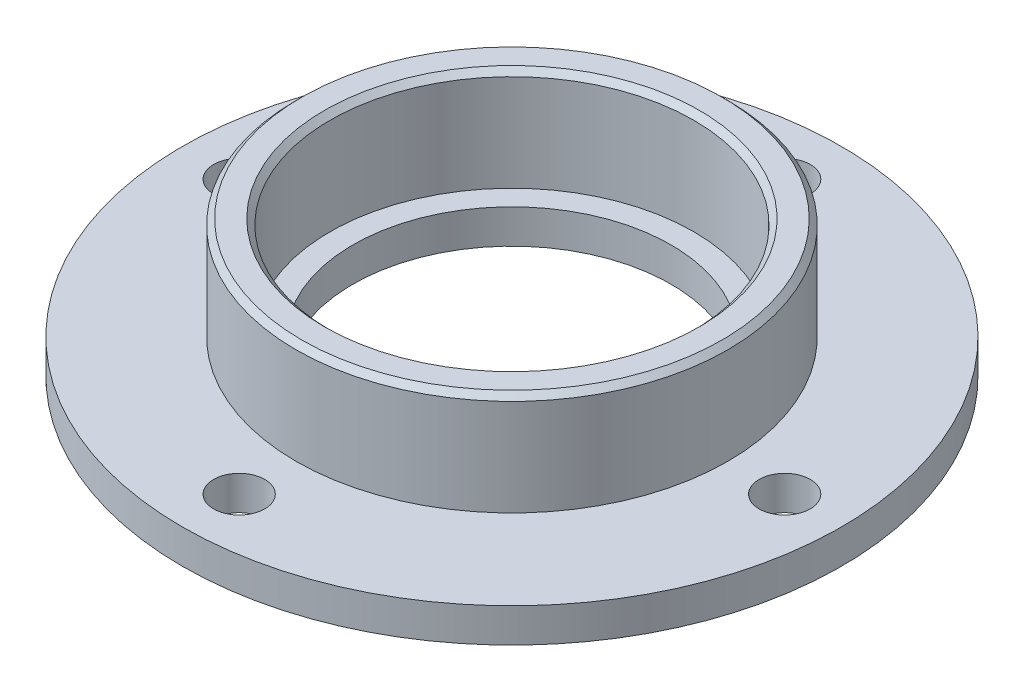
ISO-10303-21;
HEADER;
FILE_DESCRIPTION(('STEP AP214'),'2;1');
FILE_NAME('part.step','',(''),(''),'','','');
FILE_SCHEMA(('AUTOMOTIVE_DESIGN { 1 0 10303 214 1 1 1 1 }'));
ENDSEC;
DATA;
#1=APPLICATION_CONTEXT('core data for automotive mechanical design processes');
#2=APPLICATION_PROTOCOL_DEFINITION('international standard','automotive_design',2000,#1);
#3=PRODUCT_CONTEXT('',#1,'mechanical');
#4=PRODUCT('Part','Part','',(#3));
#5=PRODUCT_RELATED_PRODUCT_CATEGORY('part','',(#4));
#6=PRODUCT_DEFINITION_FORMATION('','',#4);
#7=PRODUCT_DEFINITION_CONTEXT('part definition',#1,'design');
#8=PRODUCT_DEFINITION('design','',#6,#7);
#9=PRODUCT_DEFINITION_SHAPE('','',#8);
#10=(LENGTH_UNIT() NAMED_UNIT(*) SI_UNIT(.MILLI.,.METRE.));
#11=(NAMED_UNIT(*) PLANE_ANGLE_UNIT() SI_UNIT($,.RADIAN.));
#12=(NAMED_UNIT(*) SI_UNIT($,.STERADIAN.) SOLID_ANGLE_UNIT());
#13=UNCERTAINTY_MEASURE_WITH_UNIT(LENGTH_MEASURE(1.E-05),#10,'distance_accuracy_value','');
#14=(GEOMETRIC_REPRESENTATION_CONTEXT(3) GLOBAL_UNCERTAINTY_ASSIGNED_CONTEXT((#13)) GLOBAL_UNIT_ASSIGNED_CONTEXT((#10,
#11,#12)) REPRESENTATION_CONTEXT('',''));
#15=CARTESIAN_POINT('',(0.,0.,0.));
#16=DIRECTION('',(0.,0.,1.));
#17=DIRECTION('',(1.,0.,0.));
#18=AXIS2_PLACEMENT_3D('',#15,#16,#17);
#19=CARTESIAN_POINT('',(0.,3.,0.));
#20=DIRECTION('',(0.,1.,0.));
#21=DIRECTION('',(0.,0.,1.));
#22=AXIS2_PLACEMENT_3D('',#19,#20,#21);
#23=PLANE('',#22);
#24=CARTESIAN_POINT('',(0.,3.,0.));
#25=DIRECTION('',(0.,1.,0.));
#26=DIRECTION('',(0.,0.,1.));
#27=AXIS2_PLACEMENT_3D('',#24,#25,#26);
#28=CIRCLE('',#27,14.);
#29=CARTESIAN_POINT('',(0.,3.,14.));
#30=VERTEX_POINT('',#29);
#31=EDGE_CURVE('E80',#30,#30,#28,.T.);
#32=ORIENTED_EDGE('',*,*,#31,.F.);
#33=EDGE_LOOP('',(#32));
#34=FACE_BOUND('',#33,.T.);
#35=CARTESIAN_POINT('',(0.,3.,0.));
#36=DIRECTION('',(0.,1.,0.));
#37=DIRECTION('',(0.,0.,1.));
#38=AXIS2_PLACEMENT_3D('',#35,#36,#37);
#39=CIRCLE('',#38,16.);
#40=CARTESIAN_POINT('',(0.,3.,16.));
#41=VERTEX_POINT('',#40);
#42=EDGE_CURVE('E88',#41,#41,#39,.T.);
#43=ORIENTED_EDGE('',*,*,#42,.T.);
#44=EDGE_LOOP('',(#43));
#45=FACE_BOUND('',#44,.T.);
#46=ADVANCED_FACE('F47',(#34,#45),#23,.T.);
#47=CARTESIAN_POINT('',(0.,3.,-24.));
#48=DIRECTION('',(0.,1.,0.));
#49=DIRECTION('',(0.,0.,1.));
#50=AXIS2_PLACEMENT_3D('',#47,#48,#49);
#51=CIRCLE('',#50,2.25);
#52=CARTESIAN_POINT('',(0.,3.,-21.75));
#53=VERTEX_POINT('',#52);
#54=EDGE_CURVE('E126',#53,#53,#51,.T.);
#55=ORIENTED_EDGE('',*,*,#54,.F.);
#56=EDGE_LOOP('',(#55));
#57=FACE_BOUND('',#56,.T.);
#58=CARTESIAN_POINT('',(24.,3.,0.));
#59=DIRECTION('',(0.,1.,0.));
#60=DIRECTION('',(0.,0.,1.));
#61=AXIS2_PLACEMENT_3D('',#58,#59,#60);
#62=CIRCLE('',#61,2.25);
#63=CARTESIAN_POINT('',(24.,3.,2.25));
#64=VERTEX_POINT('',#63);
#65=EDGE_CURVE('E118',#64,#64,#62,.T.);
#66=ORIENTED_EDGE('',*,*,#65,.F.);
#67=EDGE_LOOP('',(#66));
#68=FACE_BOUND('',#67,.T.);
#69=CARTESIAN_POINT('',(0.,3.,24.));
#70=DIRECTION('',(0.,1.,0.));
#71=DIRECTION('',(0.,0.,1.));
#72=AXIS2_PLACEMENT_3D('',#69,#70,#71);
#73=CIRCLE('',#72,2.25);
#74=CARTESIAN_POINT('',(0.,3.,26.25));
#75=VERTEX_POINT('',#74);
#76=EDGE_CURVE('E110',#75,#75,#73,.T.);
#77=ORIENTED_EDGE('',*,*,#76,.F.);
#78=EDGE_LOOP('',(#77));
#79=FACE_BOUND('',#78,.T.);
#80=CARTESIAN_POINT('',(-24.,3.,0.));
#81=DIRECTION('',(0.,1.,0.));
#82=DIRECTION('',(0.,0.,1.));
#83=AXIS2_PLACEMENT_3D('',#80,#81,#82);
#84=CIRCLE('',#83,2.25);
#85=CARTESIAN_POINT('',(-24.,3.,2.25));
#86=VERTEX_POINT('',#85);
#87=EDGE_CURVE('E102',#86,#86,#84,.T.);
#88=ORIENTED_EDGE('',*,*,#87,.F.);
#89=EDGE_LOOP('',(#88));
#90=FACE_BOUND('',#89,.T.);
#91=CARTESIAN_POINT('',(0.,3.,0.));
#92=DIRECTION('',(0.,1.,0.));
#93=DIRECTION('',(0.,0.,1.));
#94=AXIS2_PLACEMENT_3D('',#91,#92,#93);
#95=CIRCLE('',#94,19.);
#96=CARTESIAN_POINT('',(0.,3.,19.));
#97=VERTEX_POINT('',#96);
#98=EDGE_CURVE('E74',#97,#97,#95,.T.);
#99=ORIENTED_EDGE('',*,*,#98,.F.);
#100=EDGE_LOOP('',(#99));
#101=FACE_BOUND('',#100,.T.);
#102=CARTESIAN_POINT('',(0.,3.,0.));
#103=DIRECTION('',(0.,1.,0.));
#104=DIRECTION('',(0.,0.,1.));
#105=AXIS2_PLACEMENT_3D('',#102,#103,#104);
#106=CIRCLE('',#105,29.);
#107=CARTESIAN_POINT('',(0.,3.,29.));
#108=VERTEX_POINT('',#107);
#109=EDGE_CURVE('E79',#108,#108,#106,.T.);
#110=ORIENTED_EDGE('',*,*,#109,.T.);
#111=EDGE_LOOP('',(#110));
#112=FACE_BOUND('',#111,.T.);
#113=ADVANCED_FACE('F134',(#57,#68,#79,#90,#101,#112),#23,.T.);
#114=CARTESIAN_POINT('',(0.,0.,0.));
#115=DIRECTION('',(0.,1.,0.));
#116=DIRECTION('',(0.,0.,1.));
#117=AXIS2_PLACEMENT_3D('',#114,#115,#116);
#118=PLANE('',#117);
#119=CARTESIAN_POINT('',(0.,0.,-24.));
#120=DIRECTION('',(0.,1.,0.));
#121=DIRECTION('',(0.,0.,1.));
#122=AXIS2_PLACEMENT_3D('',#119,#120,#121);
#123=CIRCLE('',#122,2.25);
#124=CARTESIAN_POINT('',(0.,0.,-21.75));
#125=VERTEX_POINT('',#124);
#126=EDGE_CURVE('E122',#125,#125,#123,.T.);
#127=ORIENTED_EDGE('',*,*,#126,.T.);
#128=EDGE_LOOP('',(#127));
#129=FACE_BOUND('',#128,.T.);
#130=CARTESIAN_POINT('',(24.,0.,0.));
#131=DIRECTION('',(0.,1.,0.));
#132=DIRECTION('',(0.,0.,1.));
#133=AXIS2_PLACEMENT_3D('',#130,#131,#132);
#134=CIRCLE('',#133,2.25);
#135=CARTESIAN_POINT('',(24.,0.,2.25));
#136=VERTEX_POINT('',#135);
#137=EDGE_CURVE('E114',#136,#136,#134,.T.);
#138=ORIENTED_EDGE('',*,*,#137,.T.);
#139=EDGE_LOOP('',(#138));
#140=FACE_BOUND('',#139,.T.);
#141=CARTESIAN_POINT('',(0.,0.,24.));
#142=DIRECTION('',(0.,1.,0.));
#143=DIRECTION('',(0.,0.,1.));
#144=AXIS2_PLACEMENT_3D('',#141,#142,#143);
#145=CIRCLE('',#144,2.25);
#146=CARTESIAN_POINT('',(0.,0.,26.25));
#147=VERTEX_POINT('',#146);
#148=EDGE_CURVE('E106',#147,#147,#145,.T.);
#149=ORIENTED_EDGE('',*,*,#148,.T.);
#150=EDGE_LOOP('',(#149));
#151=FACE_BOUND('',#150,.T.);
#152=CARTESIAN_POINT('',(-24.,0.,0.));
#153=DIRECTION('',(0.,1.,0.));
#154=DIRECTION('',(0.,0.,1.));
#155=AXIS2_PLACEMENT_3D('',#152,#153,#154);
#156=CIRCLE('',#155,2.25);
#157=CARTESIAN_POINT('',(-24.,0.,2.25));
#158=VERTEX_POINT('',#157);
#159=EDGE_CURVE('E98',#158,#158,#156,.T.);
#160=ORIENTED_EDGE('',*,*,#159,.T.);
#161=EDGE_LOOP('',(#160));
#162=FACE_BOUND('',#161,.T.);
#163=CARTESIAN_POINT('',(0.,0.,0.));
#164=DIRECTION('',(0.,1.,0.));
#165=DIRECTION('',(0.,0.,1.));
#166=AXIS2_PLACEMENT_3D('',#163,#164,#165);
#167=CIRCLE('',#166,29.);
#168=CARTESIAN_POINT('',(0.,0.,29.));
#169=VERTEX_POINT('',#168);
#170=EDGE_CURVE('E75',#169,#169,#167,.T.);
#171=ORIENTED_EDGE('',*,*,#170,.F.);
#172=EDGE_LOOP('',(#171));
#173=FACE_BOUND('',#172,.T.);
#174=CARTESIAN_POINT('',(0.,0.,0.));
#175=DIRECTION('',(0.,1.,0.));
#176=DIRECTION('',(0.,0.,1.));
#177=AXIS2_PLACEMENT_3D('',#174,#175,#176);
#178=CIRCLE('',#177,14.);
#179=CARTESIAN_POINT('',(0.,0.,14.));
#180=VERTEX_POINT('',#179);
#181=EDGE_CURVE('E84',#180,#180,#178,.T.);
#182=ORIENTED_EDGE('',*,*,#181,.T.);
#183=EDGE_LOOP('',(#182));
#184=FACE_BOUND('',#183,.T.);
#185=ADVANCED_FACE('F137',(#129,#140,#151,#162,#173,#184),#118,.F.);
#186=CARTESIAN_POINT('',(0.,3.,0.));
#187=DIRECTION('',(0.,-1.,0.));
#188=DIRECTION('',(0.,0.,-1.));
#189=AXIS2_PLACEMENT_3D('',#186,#187,#188);
#190=CYLINDRICAL_SURFACE('',#189,29.);
#191=ORIENTED_EDGE('',*,*,#109,.F.);
#192=EDGE_LOOP('',(#191));
#193=FACE_BOUND('',#192,.T.);
#194=ORIENTED_EDGE('',*,*,#170,.T.);
#195=EDGE_LOOP('',(#194));
#196=FACE_BOUND('',#195,.T.);
#197=ADVANCED_FACE('F149',(#193,#196),#190,.T.);
#198=CARTESIAN_POINT('',(0.,3.,0.));
#199=DIRECTION('',(0.,-1.,0.));
#200=DIRECTION('',(0.,0.,-1.));
#201=AXIS2_PLACEMENT_3D('',#198,#199,#200);
#202=CYLINDRICAL_SURFACE('',#201,14.);
#203=ORIENTED_EDGE('',*,*,#31,.T.);
#204=EDGE_LOOP('',(#203));
#205=FACE_BOUND('',#204,.T.);
#206=ORIENTED_EDGE('',*,*,#181,.F.);
#207=EDGE_LOOP('',(#206));
#208=FACE_BOUND('',#207,.T.);
#209=ADVANCED_FACE('F152',(#205,#208),#202,.F.);
#210=CARTESIAN_POINT('',(0.,12.,0.));
#211=DIRECTION('',(0.,1.,0.));
#212=DIRECTION('',(0.,0.,1.));
#213=AXIS2_PLACEMENT_3D('',#210,#211,#212);
#214=PLANE('',#213);
#215=CARTESIAN_POINT('',(0.,12.,0.));
#216=DIRECTION('',(0.,1.,0.));
#217=DIRECTION('',(0.,0.,1.));
#218=AXIS2_PLACEMENT_3D('',#215,#216,#217);
#219=CIRCLE('',#218,18.5);
#220=CARTESIAN_POINT('',(0.,12.,18.5));
#221=VERTEX_POINT('',#220);
#222=EDGE_CURVE('E62',#221,#221,#219,.T.);
#223=ORIENTED_EDGE('',*,*,#222,.T.);
#224=EDGE_LOOP('',(#223));
#225=FACE_BOUND('',#224,.T.);
#226=CARTESIAN_POINT('',(0.,12.,0.));
#227=DIRECTION('',(0.,1.,0.));
#228=DIRECTION('',(0.,0.,1.));
#229=AXIS2_PLACEMENT_3D('',#226,#227,#228);
#230=CIRCLE('',#229,16.5);
#231=CARTESIAN_POINT('',(0.,12.,16.5));
#232=VERTEX_POINT('',#231);
#233=EDGE_CURVE('E68',#232,#232,#230,.F.);
#234=ORIENTED_EDGE('',*,*,#233,.T.);
#235=EDGE_LOOP('',(#234));
#236=FACE_BOUND('',#235,.T.);
#237=ADVANCED_FACE('F163',(#225,#236),#214,.T.);
#238=CARTESIAN_POINT('',(0.,12.,0.));
#239=DIRECTION('',(0.,-1.,0.));
#240=DIRECTION('',(0.,0.,-1.));
#241=AXIS2_PLACEMENT_3D('',#238,#239,#240);
#242=CYLINDRICAL_SURFACE('',#241,19.);
#243=CARTESIAN_POINT('',(0.,11.5,0.));
#244=DIRECTION('',(0.,1.,0.));
#245=DIRECTION('',(0.,0.,1.));
#246=AXIS2_PLACEMENT_3D('',#243,#244,#245);
#247=CIRCLE('',#246,19.);
#248=CARTESIAN_POINT('',(0.,11.5,19.));
#249=VERTEX_POINT('',#248);
#250=EDGE_CURVE('E56',#249,#249,#247,.F.);
#251=ORIENTED_EDGE('',*,*,#250,.T.);
#252=EDGE_LOOP('',(#251));
#253=FACE_BOUND('',#252,.T.);
#254=ORIENTED_EDGE('',*,*,#98,.T.);
#255=EDGE_LOOP('',(#254));
#256=FACE_BOUND('',#255,.T.);
#257=ADVANCED_FACE('F170',(#253,#256),#242,.T.);
#258=CARTESIAN_POINT('',(0.,12.,0.));
#259=DIRECTION('',(0.,-1.,0.));
#260=DIRECTION('',(0.,0.,-1.));
#261=AXIS2_PLACEMENT_3D('',#258,#259,#260);
#262=CYLINDRICAL_SURFACE('',#261,16.);
#263=CARTESIAN_POINT('',(0.,11.5,0.));
#264=DIRECTION('',(0.,1.,0.));
#265=DIRECTION('',(0.,0.,1.));
#266=AXIS2_PLACEMENT_3D('',#263,#264,#265);
#267=CIRCLE('',#266,16.);
#268=CARTESIAN_POINT('',(0.,11.5,16.));
#269=VERTEX_POINT('',#268);
#270=EDGE_CURVE('E10',#269,#269,#267,.T.);
#271=ORIENTED_EDGE('',*,*,#270,.T.);
#272=EDGE_LOOP('',(#271));
#273=FACE_BOUND('',#272,.T.);
#274=ORIENTED_EDGE('',*,*,#42,.F.);
#275=EDGE_LOOP('',(#274));
#276=FACE_BOUND('',#275,.T.);
#277=ADVANCED_FACE('F213',(#273,#276),#262,.F.);
#278=CARTESIAN_POINT('',(-24.,3.,0.));
#279=DIRECTION('',(0.,1.,0.));
#280=DIRECTION('',(0.,0.,1.));
#281=AXIS2_PLACEMENT_3D('',#278,#279,#280);
#282=CYLINDRICAL_SURFACE('',#281,2.25);
#283=ORIENTED_EDGE('',*,*,#159,.F.);
#284=EDGE_LOOP('',(#283));
#285=FACE_BOUND('',#284,.T.);
#286=ORIENTED_EDGE('',*,*,#87,.T.);
#287=EDGE_LOOP('',(#286));
#288=FACE_BOUND('',#287,.T.);
#289=ADVANCED_FACE('F209',(#285,#288),#282,.F.);
#290=CARTESIAN_POINT('',(0.,3.,24.));
#291=DIRECTION('',(0.,1.,0.));
#292=DIRECTION('',(0.,0.,1.));
#293=AXIS2_PLACEMENT_3D('',#290,#291,#292);
#294=CYLINDRICAL_SURFACE('',#293,2.25);
#295=ORIENTED_EDGE('',*,*,#148,.F.);
#296=EDGE_LOOP('',(#295));
#297=FACE_BOUND('',#296,.T.);
#298=ORIENTED_EDGE('',*,*,#76,.T.);
#299=EDGE_LOOP('',(#298));
#300=FACE_BOUND('',#299,.T.);
#301=ADVANCED_FACE('F202',(#297,#300),#294,.F.);
#302=CARTESIAN_POINT('',(24.,3.,0.));
#303=DIRECTION('',(0.,1.,0.));
#304=DIRECTION('',(0.,0.,1.));
#305=AXIS2_PLACEMENT_3D('',#302,#303,#304);
#306=CYLINDRICAL_SURFACE('',#305,2.25);
#307=ORIENTED_EDGE('',*,*,#137,.F.);
#308=EDGE_LOOP('',(#307));
#309=FACE_BOUND('',#308,.T.);
#310=ORIENTED_EDGE('',*,*,#65,.T.);
#311=EDGE_LOOP('',(#310));
#312=FACE_BOUND('',#311,.T.);
#313=ADVANCED_FACE('F191',(#309,#312),#306,.F.);
#314=CARTESIAN_POINT('',(0.,3.,-24.));
#315=DIRECTION('',(0.,1.,0.));
#316=DIRECTION('',(0.,0.,1.));
#317=AXIS2_PLACEMENT_3D('',#314,#315,#316);
#318=CYLINDRICAL_SURFACE('',#317,2.25);
#319=ORIENTED_EDGE('',*,*,#126,.F.);
#320=EDGE_LOOP('',(#319));
#321=FACE_BOUND('',#320,.T.);
#322=ORIENTED_EDGE('',*,*,#54,.T.);
#323=EDGE_LOOP('',(#322));
#324=FACE_BOUND('',#323,.T.);
#325=ADVANCED_FACE('F132',(#321,#324),#318,.F.);
#326=CARTESIAN_POINT('',(0.,12.,0.));
#327=DIRECTION('',(0.,-1.,0.));
#328=DIRECTION('',(0.,0.,-1.));
#329=AXIS2_PLACEMENT_3D('',#326,#327,#328);
#330=CONICAL_SURFACE('',#329,18.5,0.785398163397445);
#331=ORIENTED_EDGE('',*,*,#250,.F.);
#332=EDGE_LOOP('',(#331));
#333=FACE_BOUND('',#332,.T.);
#334=ORIENTED_EDGE('',*,*,#222,.F.);
#335=EDGE_LOOP('',(#334));
#336=FACE_BOUND('',#335,.T.);
#337=ADVANCED_FACE('F180',(#333,#336),#330,.T.);
#338=CARTESIAN_POINT('',(0.,11.5,0.));
#339=DIRECTION('',(0.,1.,0.));
#340=DIRECTION('',(0.,0.,1.));
#341=AXIS2_PLACEMENT_3D('',#338,#339,#340);
#342=CONICAL_SURFACE('',#341,16.,0.785398163397441);
#343=ORIENTED_EDGE('',*,*,#233,.F.);
#344=EDGE_LOOP('',(#343));
#345=FACE_BOUND('',#344,.T.);
#346=ORIENTED_EDGE('',*,*,#270,.F.);
#347=EDGE_LOOP('',(#346));
#348=FACE_BOUND('',#347,.T.);
#349=ADVANCED_FACE('F50',(#345,#348),#342,.F.);
#350=CLOSED_SHELL('',(#46,#113,#185,#197,#209,#237,#257,#277,#289,#301,#313,#325,#337,#349));
#351=MANIFOLD_SOLID_BREP('B2',#350);
#352=ADVANCED_BREP_SHAPE_REPRESENTATION('',(#18,#351),#14);
#353=SHAPE_DEFINITION_REPRESENTATION(#9,#352);
ENDSEC;
END-ISO-10303-21;
